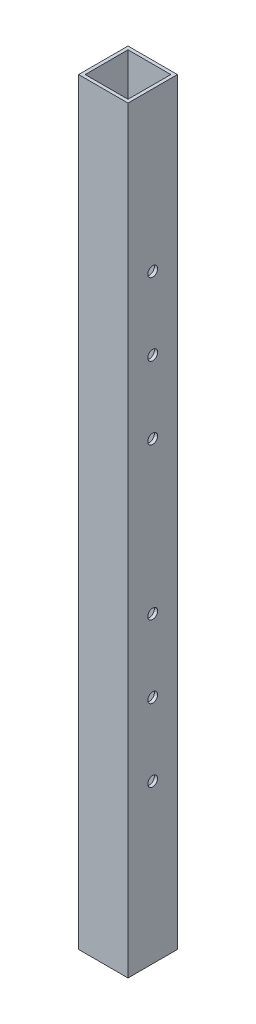
ISO-10303-21;
HEADER;
FILE_DESCRIPTION(('STEP AP214'),'2;1');
FILE_NAME('part.step','',(''),(''),'','','');
FILE_SCHEMA(('AUTOMOTIVE_DESIGN { 1 0 10303 214 1 1 1 1 }'));
ENDSEC;
DATA;
#1=APPLICATION_CONTEXT('core data for automotive mechanical design processes');
#2=APPLICATION_PROTOCOL_DEFINITION('international standard','automotive_design',2000,#1);
#3=PRODUCT_CONTEXT('',#1,'mechanical');
#4=PRODUCT('Part','Part','',(#3));
#5=PRODUCT_RELATED_PRODUCT_CATEGORY('part','',(#4));
#6=PRODUCT_DEFINITION_FORMATION('','',#4);
#7=PRODUCT_DEFINITION_CONTEXT('part definition',#1,'design');
#8=PRODUCT_DEFINITION('design','',#6,#7);
#9=PRODUCT_DEFINITION_SHAPE('','',#8);
#10=(LENGTH_UNIT() NAMED_UNIT(*) SI_UNIT(.MILLI.,.METRE.));
#11=(NAMED_UNIT(*) PLANE_ANGLE_UNIT() SI_UNIT($,.RADIAN.));
#12=(NAMED_UNIT(*) SI_UNIT($,.STERADIAN.) SOLID_ANGLE_UNIT());
#13=UNCERTAINTY_MEASURE_WITH_UNIT(LENGTH_MEASURE(1.E-05),#10,'distance_accuracy_value','');
#14=(GEOMETRIC_REPRESENTATION_CONTEXT(3) GLOBAL_UNCERTAINTY_ASSIGNED_CONTEXT((#13)) GLOBAL_UNIT_ASSIGNED_CONTEXT((#10,
#11,#12)) REPRESENTATION_CONTEXT('',''));
#15=CARTESIAN_POINT('',(0.,0.,0.));
#16=DIRECTION('',(0.,0.,1.));
#17=DIRECTION('',(1.,0.,0.));
#18=AXIS2_PLACEMENT_3D('',#15,#16,#17);
#19=CARTESIAN_POINT('',(0.,230.,0.));
#20=DIRECTION('',(0.,-1.,0.));
#21=DIRECTION('',(0.,0.,-1.));
#22=AXIS2_PLACEMENT_3D('',#19,#20,#21);
#23=PLANE('',#22);
#24=DIRECTION('',(0.,0.,-1.));
#25=VECTOR('',#24,1.);
#26=CARTESIAN_POINT('',(7.5,230.,7.5));
#27=LINE('',#26,#25);
#28=CARTESIAN_POINT('',(7.5,230.,7.5));
#29=VERTEX_POINT('',#28);
#30=CARTESIAN_POINT('',(7.5,230.,-7.5));
#31=VERTEX_POINT('',#30);
#32=EDGE_CURVE('E140',#29,#31,#27,.T.);
#33=ORIENTED_EDGE('',*,*,#32,.T.);
#34=DIRECTION('',(-1.,0.,0.));
#35=VECTOR('',#34,1.);
#36=CARTESIAN_POINT('',(-7.5,230.,-7.5));
#37=LINE('',#36,#35);
#38=CARTESIAN_POINT('',(-7.5,230.,-7.5));
#39=VERTEX_POINT('',#38);
#40=EDGE_CURVE('E143',#31,#39,#37,.T.);
#41=ORIENTED_EDGE('',*,*,#40,.T.);
#42=DIRECTION('',(0.,0.,1.));
#43=VECTOR('',#42,1.);
#44=CARTESIAN_POINT('',(-7.5,230.,7.5));
#45=LINE('',#44,#43);
#46=CARTESIAN_POINT('',(-7.5,230.,7.5));
#47=VERTEX_POINT('',#46);
#48=EDGE_CURVE('E146',#39,#47,#45,.T.);
#49=ORIENTED_EDGE('',*,*,#48,.T.);
#50=DIRECTION('',(1.,0.,0.));
#51=VECTOR('',#50,1.);
#52=CARTESIAN_POINT('',(-7.5,230.,7.5));
#53=LINE('',#52,#51);
#54=EDGE_CURVE('E148',#47,#29,#53,.T.);
#55=ORIENTED_EDGE('',*,*,#54,.T.);
#56=EDGE_LOOP('',(#33,#41,#49,#55));
#57=FACE_BOUND('',#56,.T.);
#58=DIRECTION('',(0.,0.,1.));
#59=VECTOR('',#58,1.);
#60=CARTESIAN_POINT('',(-6.5,230.,6.5));
#61=LINE('',#60,#59);
#62=CARTESIAN_POINT('',(-6.5,230.,-6.5));
#63=VERTEX_POINT('',#62);
#64=CARTESIAN_POINT('',(-6.5,230.,6.5));
#65=VERTEX_POINT('',#64);
#66=EDGE_CURVE('E102',#63,#65,#61,.T.);
#67=ORIENTED_EDGE('',*,*,#66,.F.);
#68=DIRECTION('',(-1.,0.,0.));
#69=VECTOR('',#68,1.);
#70=CARTESIAN_POINT('',(-6.5,230.,-6.5));
#71=LINE('',#70,#69);
#72=CARTESIAN_POINT('',(6.5,230.,-6.5));
#73=VERTEX_POINT('',#72);
#74=EDGE_CURVE('E124',#73,#63,#71,.T.);
#75=ORIENTED_EDGE('',*,*,#74,.F.);
#76=DIRECTION('',(0.,0.,-1.));
#77=VECTOR('',#76,1.);
#78=CARTESIAN_POINT('',(6.5,230.,6.5));
#79=LINE('',#78,#77);
#80=CARTESIAN_POINT('',(6.5,230.,6.5));
#81=VERTEX_POINT('',#80);
#82=EDGE_CURVE('E122',#81,#73,#79,.T.);
#83=ORIENTED_EDGE('',*,*,#82,.F.);
#84=DIRECTION('',(1.,0.,0.));
#85=VECTOR('',#84,1.);
#86=CARTESIAN_POINT('',(-6.5,230.,6.5));
#87=LINE('',#86,#85);
#88=EDGE_CURVE('E110',#65,#81,#87,.T.);
#89=ORIENTED_EDGE('',*,*,#88,.F.);
#90=EDGE_LOOP('',(#67,#75,#83,#89));
#91=FACE_BOUND('',#90,.T.);
#92=ADVANCED_FACE('F35',(#57,#91),#23,.F.);
#93=CARTESIAN_POINT('',(0.,0.,0.));
#94=DIRECTION('',(0.,-1.,0.));
#95=DIRECTION('',(0.,0.,-1.));
#96=AXIS2_PLACEMENT_3D('',#93,#94,#95);
#97=PLANE('',#96);
#98=DIRECTION('',(0.,0.,-1.));
#99=VECTOR('',#98,1.);
#100=CARTESIAN_POINT('',(7.5,0.,7.5));
#101=LINE('',#100,#99);
#102=CARTESIAN_POINT('',(7.5,0.,7.5));
#103=VERTEX_POINT('',#102);
#104=CARTESIAN_POINT('',(7.5,0.,-7.5));
#105=VERTEX_POINT('',#104);
#106=EDGE_CURVE('E118',#103,#105,#101,.T.);
#107=ORIENTED_EDGE('',*,*,#106,.F.);
#108=DIRECTION('',(1.,0.,0.));
#109=VECTOR('',#108,1.);
#110=CARTESIAN_POINT('',(-7.5,0.,7.5));
#111=LINE('',#110,#109);
#112=CARTESIAN_POINT('',(-7.5,0.,7.5));
#113=VERTEX_POINT('',#112);
#114=EDGE_CURVE('E144',#113,#103,#111,.T.);
#115=ORIENTED_EDGE('',*,*,#114,.F.);
#116=DIRECTION('',(0.,0.,1.));
#117=VECTOR('',#116,1.);
#118=CARTESIAN_POINT('',(-7.5,0.,7.5));
#119=LINE('',#118,#117);
#120=CARTESIAN_POINT('',(-7.5,0.,-7.5));
#121=VERTEX_POINT('',#120);
#122=EDGE_CURVE('E155',#121,#113,#119,.T.);
#123=ORIENTED_EDGE('',*,*,#122,.F.);
#124=DIRECTION('',(-1.,0.,0.));
#125=VECTOR('',#124,1.);
#126=CARTESIAN_POINT('',(-7.5,0.,-7.5));
#127=LINE('',#126,#125);
#128=EDGE_CURVE('E153',#105,#121,#127,.T.);
#129=ORIENTED_EDGE('',*,*,#128,.F.);
#130=EDGE_LOOP('',(#107,#115,#123,#129));
#131=FACE_BOUND('',#130,.T.);
#132=DIRECTION('',(-1.,0.,0.));
#133=VECTOR('',#132,1.);
#134=CARTESIAN_POINT('',(-6.5,0.,-6.5));
#135=LINE('',#134,#133);
#136=CARTESIAN_POINT('',(6.5,0.,-6.5));
#137=VERTEX_POINT('',#136);
#138=CARTESIAN_POINT('',(-6.5,0.,-6.5));
#139=VERTEX_POINT('',#138);
#140=EDGE_CURVE('E111',#137,#139,#135,.T.);
#141=ORIENTED_EDGE('',*,*,#140,.T.);
#142=DIRECTION('',(0.,0.,1.));
#143=VECTOR('',#142,1.);
#144=CARTESIAN_POINT('',(-6.5,0.,6.5));
#145=LINE('',#144,#143);
#146=CARTESIAN_POINT('',(-6.5,0.,6.5));
#147=VERTEX_POINT('',#146);
#148=EDGE_CURVE('E60',#139,#147,#145,.T.);
#149=ORIENTED_EDGE('',*,*,#148,.T.);
#150=DIRECTION('',(1.,0.,0.));
#151=VECTOR('',#150,1.);
#152=CARTESIAN_POINT('',(-6.5,0.,6.5));
#153=LINE('',#152,#151);
#154=CARTESIAN_POINT('',(6.5,0.,6.5));
#155=VERTEX_POINT('',#154);
#156=EDGE_CURVE('E117',#147,#155,#153,.T.);
#157=ORIENTED_EDGE('',*,*,#156,.T.);
#158=DIRECTION('',(0.,0.,-1.));
#159=VECTOR('',#158,1.);
#160=CARTESIAN_POINT('',(6.5,0.,6.5));
#161=LINE('',#160,#159);
#162=EDGE_CURVE('E132',#155,#137,#161,.T.);
#163=ORIENTED_EDGE('',*,*,#162,.T.);
#164=EDGE_LOOP('',(#141,#149,#157,#163));
#165=FACE_BOUND('',#164,.T.);
#166=ADVANCED_FACE('F227',(#131,#165),#97,.T.);
#167=CARTESIAN_POINT('',(7.5,230.,7.5));
#168=DIRECTION('',(-1.,0.,0.));
#169=DIRECTION('',(0.,0.,1.));
#170=AXIS2_PLACEMENT_3D('',#167,#168,#169);
#171=PLANE('',#170);
#172=CARTESIAN_POINT('',(7.5,138.,0.));
#173=DIRECTION('',(1.,0.,0.));
#174=DIRECTION('',(0.,0.,-1.));
#175=AXIS2_PLACEMENT_3D('',#172,#173,#174);
#176=CIRCLE('',#175,1.5);
#177=CARTESIAN_POINT('',(7.5,138.,-1.49999999999998));
#178=VERTEX_POINT('',#177);
#179=EDGE_CURVE('E310',#178,#178,#176,.T.);
#180=ORIENTED_EDGE('',*,*,#179,.F.);
#181=EDGE_LOOP('',(#180));
#182=FACE_BOUND('',#181,.T.);
#183=CARTESIAN_POINT('',(7.5,182.,0.));
#184=DIRECTION('',(1.,0.,0.));
#185=DIRECTION('',(0.,0.,-1.));
#186=AXIS2_PLACEMENT_3D('',#183,#184,#185);
#187=CIRCLE('',#186,1.5);
#188=CARTESIAN_POINT('',(7.5,182.,-1.49999999999998));
#189=VERTEX_POINT('',#188);
#190=EDGE_CURVE('E318',#189,#189,#187,.T.);
#191=ORIENTED_EDGE('',*,*,#190,.F.);
#192=EDGE_LOOP('',(#191));
#193=FACE_BOUND('',#192,.T.);
#194=CARTESIAN_POINT('',(7.5,48.,0.));
#195=DIRECTION('',(1.,0.,0.));
#196=DIRECTION('',(0.,0.,1.));
#197=AXIS2_PLACEMENT_3D('',#194,#195,#196);
#198=CIRCLE('',#197,1.5);
#199=CARTESIAN_POINT('',(7.5,48.,1.50000000000002));
#200=VERTEX_POINT('',#199);
#201=EDGE_CURVE('E324',#200,#200,#198,.T.);
#202=ORIENTED_EDGE('',*,*,#201,.F.);
#203=EDGE_LOOP('',(#202));
#204=FACE_BOUND('',#203,.T.);
#205=CARTESIAN_POINT('',(7.5,92.,0.));
#206=DIRECTION('',(1.,0.,0.));
#207=DIRECTION('',(0.,0.,1.));
#208=AXIS2_PLACEMENT_3D('',#205,#206,#207);
#209=CIRCLE('',#208,1.5);
#210=CARTESIAN_POINT('',(7.5,92.,1.50000000000002));
#211=VERTEX_POINT('',#210);
#212=EDGE_CURVE('E330',#211,#211,#209,.T.);
#213=ORIENTED_EDGE('',*,*,#212,.F.);
#214=EDGE_LOOP('',(#213));
#215=FACE_BOUND('',#214,.T.);
#216=CARTESIAN_POINT('',(7.5,70.,0.));
#217=DIRECTION('',(1.,0.,0.));
#218=DIRECTION('',(0.,0.,1.));
#219=AXIS2_PLACEMENT_3D('',#216,#217,#218);
#220=CIRCLE('',#219,1.5);
#221=CARTESIAN_POINT('',(7.5,70.,1.50000000000002));
#222=VERTEX_POINT('',#221);
#223=EDGE_CURVE('E336',#222,#222,#220,.T.);
#224=ORIENTED_EDGE('',*,*,#223,.F.);
#225=EDGE_LOOP('',(#224));
#226=FACE_BOUND('',#225,.T.);
#227=CARTESIAN_POINT('',(7.5,160.,0.));
#228=DIRECTION('',(1.,0.,0.));
#229=DIRECTION('',(0.,0.,-1.));
#230=AXIS2_PLACEMENT_3D('',#227,#228,#229);
#231=CIRCLE('',#230,1.5);
#232=CARTESIAN_POINT('',(7.5,160.,-1.49999999999998));
#233=VERTEX_POINT('',#232);
#234=EDGE_CURVE('E198',#233,#233,#231,.T.);
#235=ORIENTED_EDGE('',*,*,#234,.F.);
#236=EDGE_LOOP('',(#235));
#237=FACE_BOUND('',#236,.T.);
#238=ORIENTED_EDGE('',*,*,#106,.T.);
#239=DIRECTION('',(0.,-1.,0.));
#240=VECTOR('',#239,1.);
#241=CARTESIAN_POINT('',(7.5,230.,-7.5));
#242=LINE('',#241,#240);
#243=EDGE_CURVE('E11',#31,#105,#242,.T.);
#244=ORIENTED_EDGE('',*,*,#243,.F.);
#245=ORIENTED_EDGE('',*,*,#32,.F.);
#246=DIRECTION('',(0.,-1.,0.));
#247=VECTOR('',#246,1.);
#248=CARTESIAN_POINT('',(7.5,230.,7.5));
#249=LINE('',#248,#247);
#250=EDGE_CURVE('E150',#29,#103,#249,.T.);
#251=ORIENTED_EDGE('',*,*,#250,.T.);
#252=EDGE_LOOP('',(#238,#244,#245,#251));
#253=FACE_BOUND('',#252,.T.);
#254=ADVANCED_FACE('F37',(#182,#193,#204,#215,#226,#237,#253),#171,.F.);
#255=CARTESIAN_POINT('',(-7.5,230.,-7.5));
#256=DIRECTION('',(0.,0.,1.));
#257=DIRECTION('',(1.,0.,0.));
#258=AXIS2_PLACEMENT_3D('',#255,#256,#257);
#259=PLANE('',#258);
#260=ORIENTED_EDGE('',*,*,#128,.T.);
#261=DIRECTION('',(0.,-1.,0.));
#262=VECTOR('',#261,1.);
#263=CARTESIAN_POINT('',(-7.5,230.,-7.5));
#264=LINE('',#263,#262);
#265=EDGE_CURVE('E44',#39,#121,#264,.T.);
#266=ORIENTED_EDGE('',*,*,#265,.F.);
#267=ORIENTED_EDGE('',*,*,#40,.F.);
#268=ORIENTED_EDGE('',*,*,#243,.T.);
#269=EDGE_LOOP('',(#260,#266,#267,#268));
#270=FACE_BOUND('',#269,.T.);
#271=ADVANCED_FACE('F235',(#270),#259,.F.);
#272=CARTESIAN_POINT('',(-7.5,230.,7.5));
#273=DIRECTION('',(1.,0.,0.));
#274=DIRECTION('',(0.,0.,-1.));
#275=AXIS2_PLACEMENT_3D('',#272,#273,#274);
#276=PLANE('',#275);
#277=CARTESIAN_POINT('',(-7.5,138.,0.));
#278=DIRECTION('',(1.,0.,0.));
#279=DIRECTION('',(0.,0.,-1.));
#280=AXIS2_PLACEMENT_3D('',#277,#278,#279);
#281=CIRCLE('',#280,1.5);
#282=CARTESIAN_POINT('',(-7.5,138.,-1.49999999999998));
#283=VERTEX_POINT('',#282);
#284=EDGE_CURVE('E173',#283,#283,#281,.T.);
#285=ORIENTED_EDGE('',*,*,#284,.T.);
#286=EDGE_LOOP('',(#285));
#287=FACE_BOUND('',#286,.T.);
#288=CARTESIAN_POINT('',(-7.5,182.,0.));
#289=DIRECTION('',(1.,0.,0.));
#290=DIRECTION('',(0.,0.,-1.));
#291=AXIS2_PLACEMENT_3D('',#288,#289,#290);
#292=CIRCLE('',#291,1.5);
#293=CARTESIAN_POINT('',(-7.5,182.,-1.49999999999998));
#294=VERTEX_POINT('',#293);
#295=EDGE_CURVE('E313',#294,#294,#292,.T.);
#296=ORIENTED_EDGE('',*,*,#295,.T.);
#297=EDGE_LOOP('',(#296));
#298=FACE_BOUND('',#297,.T.);
#299=CARTESIAN_POINT('',(-7.5,48.,0.));
#300=DIRECTION('',(1.,0.,0.));
#301=DIRECTION('',(0.,0.,1.));
#302=AXIS2_PLACEMENT_3D('',#299,#300,#301);
#303=CIRCLE('',#302,1.5);
#304=CARTESIAN_POINT('',(-7.5,48.,1.50000000000002));
#305=VERTEX_POINT('',#304);
#306=EDGE_CURVE('E321',#305,#305,#303,.T.);
#307=ORIENTED_EDGE('',*,*,#306,.T.);
#308=EDGE_LOOP('',(#307));
#309=FACE_BOUND('',#308,.T.);
#310=CARTESIAN_POINT('',(-7.5,92.,0.));
#311=DIRECTION('',(1.,0.,0.));
#312=DIRECTION('',(0.,0.,1.));
#313=AXIS2_PLACEMENT_3D('',#310,#311,#312);
#314=CIRCLE('',#313,1.5);
#315=CARTESIAN_POINT('',(-7.5,92.,1.50000000000002));
#316=VERTEX_POINT('',#315);
#317=EDGE_CURVE('E327',#316,#316,#314,.T.);
#318=ORIENTED_EDGE('',*,*,#317,.T.);
#319=EDGE_LOOP('',(#318));
#320=FACE_BOUND('',#319,.T.);
#321=CARTESIAN_POINT('',(-7.5,70.,0.));
#322=DIRECTION('',(1.,0.,0.));
#323=DIRECTION('',(0.,0.,1.));
#324=AXIS2_PLACEMENT_3D('',#321,#322,#323);
#325=CIRCLE('',#324,1.5);
#326=CARTESIAN_POINT('',(-7.5,70.,1.50000000000002));
#327=VERTEX_POINT('',#326);
#328=EDGE_CURVE('E333',#327,#327,#325,.T.);
#329=ORIENTED_EDGE('',*,*,#328,.T.);
#330=EDGE_LOOP('',(#329));
#331=FACE_BOUND('',#330,.T.);
#332=CARTESIAN_POINT('',(-7.5,160.,0.));
#333=DIRECTION('',(1.,0.,0.));
#334=DIRECTION('',(0.,0.,-1.));
#335=AXIS2_PLACEMENT_3D('',#332,#333,#334);
#336=CIRCLE('',#335,1.5);
#337=CARTESIAN_POINT('',(-7.5,160.,-1.49999999999998));
#338=VERTEX_POINT('',#337);
#339=EDGE_CURVE('E168',#338,#338,#336,.T.);
#340=ORIENTED_EDGE('',*,*,#339,.T.);
#341=EDGE_LOOP('',(#340));
#342=FACE_BOUND('',#341,.T.);
#343=ORIENTED_EDGE('',*,*,#122,.T.);
#344=DIRECTION('',(0.,-1.,0.));
#345=VECTOR('',#344,1.);
#346=CARTESIAN_POINT('',(-7.5,230.,7.5));
#347=LINE('',#346,#345);
#348=EDGE_CURVE('E160',#47,#113,#347,.T.);
#349=ORIENTED_EDGE('',*,*,#348,.F.);
#350=ORIENTED_EDGE('',*,*,#48,.F.);
#351=ORIENTED_EDGE('',*,*,#265,.T.);
#352=EDGE_LOOP('',(#343,#349,#350,#351));
#353=FACE_BOUND('',#352,.T.);
#354=ADVANCED_FACE('F220',(#287,#298,#309,#320,#331,#342,#353),#276,.F.);
#355=CARTESIAN_POINT('',(-7.5,230.,7.5));
#356=DIRECTION('',(0.,0.,-1.));
#357=DIRECTION('',(-1.,0.,0.));
#358=AXIS2_PLACEMENT_3D('',#355,#356,#357);
#359=PLANE('',#358);
#360=ORIENTED_EDGE('',*,*,#114,.T.);
#361=ORIENTED_EDGE('',*,*,#250,.F.);
#362=ORIENTED_EDGE('',*,*,#54,.F.);
#363=ORIENTED_EDGE('',*,*,#348,.T.);
#364=EDGE_LOOP('',(#360,#361,#362,#363));
#365=FACE_BOUND('',#364,.T.);
#366=ADVANCED_FACE('F209',(#365),#359,.F.);
#367=CARTESIAN_POINT('',(-6.5,230.,6.5));
#368=DIRECTION('',(1.,0.,0.));
#369=DIRECTION('',(0.,0.,-1.));
#370=AXIS2_PLACEMENT_3D('',#367,#368,#369);
#371=PLANE('',#370);
#372=CARTESIAN_POINT('',(-6.5,138.,0.));
#373=DIRECTION('',(1.,0.,0.));
#374=DIRECTION('',(0.,0.,-1.));
#375=AXIS2_PLACEMENT_3D('',#372,#373,#374);
#376=CIRCLE('',#375,1.5);
#377=CARTESIAN_POINT('',(-6.5,138.,-1.49999999999998));
#378=VERTEX_POINT('',#377);
#379=EDGE_CURVE('E195',#378,#378,#376,.T.);
#380=ORIENTED_EDGE('',*,*,#379,.F.);
#381=EDGE_LOOP('',(#380));
#382=FACE_BOUND('',#381,.T.);
#383=CARTESIAN_POINT('',(-6.5,182.,0.));
#384=DIRECTION('',(1.,0.,0.));
#385=DIRECTION('',(0.,0.,-1.));
#386=AXIS2_PLACEMENT_3D('',#383,#384,#385);
#387=CIRCLE('',#386,1.5);
#388=CARTESIAN_POINT('',(-6.5,182.,-1.49999999999998));
#389=VERTEX_POINT('',#388);
#390=EDGE_CURVE('E183',#389,#389,#387,.T.);
#391=ORIENTED_EDGE('',*,*,#390,.F.);
#392=EDGE_LOOP('',(#391));
#393=FACE_BOUND('',#392,.T.);
#394=CARTESIAN_POINT('',(-6.5,48.,0.));
#395=DIRECTION('',(1.,0.,0.));
#396=DIRECTION('',(0.,0.,-1.));
#397=AXIS2_PLACEMENT_3D('',#394,#395,#396);
#398=CIRCLE('',#397,1.5);
#399=CARTESIAN_POINT('',(-6.5,48.,-1.49999999999998));
#400=VERTEX_POINT('',#399);
#401=EDGE_CURVE('E180',#400,#400,#398,.T.);
#402=ORIENTED_EDGE('',*,*,#401,.F.);
#403=EDGE_LOOP('',(#402));
#404=FACE_BOUND('',#403,.T.);
#405=CARTESIAN_POINT('',(-6.5,92.,0.));
#406=DIRECTION('',(1.,0.,0.));
#407=DIRECTION('',(0.,0.,-1.));
#408=AXIS2_PLACEMENT_3D('',#405,#406,#407);
#409=CIRCLE('',#408,1.5);
#410=CARTESIAN_POINT('',(-6.5,92.,-1.49999999999998));
#411=VERTEX_POINT('',#410);
#412=EDGE_CURVE('E177',#411,#411,#409,.T.);
#413=ORIENTED_EDGE('',*,*,#412,.F.);
#414=EDGE_LOOP('',(#413));
#415=FACE_BOUND('',#414,.T.);
#416=CARTESIAN_POINT('',(-6.5,70.,0.));
#417=DIRECTION('',(1.,0.,0.));
#418=DIRECTION('',(0.,0.,-1.));
#419=AXIS2_PLACEMENT_3D('',#416,#417,#418);
#420=CIRCLE('',#419,1.5);
#421=CARTESIAN_POINT('',(-6.5,70.,-1.49999999999998));
#422=VERTEX_POINT('',#421);
#423=EDGE_CURVE('E172',#422,#422,#420,.T.);
#424=ORIENTED_EDGE('',*,*,#423,.F.);
#425=EDGE_LOOP('',(#424));
#426=FACE_BOUND('',#425,.T.);
#427=CARTESIAN_POINT('',(-6.5,160.,0.));
#428=DIRECTION('',(1.,0.,0.));
#429=DIRECTION('',(0.,0.,-1.));
#430=AXIS2_PLACEMENT_3D('',#427,#428,#429);
#431=CIRCLE('',#430,1.5);
#432=CARTESIAN_POINT('',(-6.5,160.,-1.49999999999998));
#433=VERTEX_POINT('',#432);
#434=EDGE_CURVE('E130',#433,#433,#431,.T.);
#435=ORIENTED_EDGE('',*,*,#434,.F.);
#436=EDGE_LOOP('',(#435));
#437=FACE_BOUND('',#436,.T.);
#438=ORIENTED_EDGE('',*,*,#148,.F.);
#439=DIRECTION('',(0.,-1.,0.));
#440=VECTOR('',#439,1.);
#441=CARTESIAN_POINT('',(-6.5,230.,-6.5));
#442=LINE('',#441,#440);
#443=EDGE_CURVE('E106',#63,#139,#442,.T.);
#444=ORIENTED_EDGE('',*,*,#443,.F.);
#445=ORIENTED_EDGE('',*,*,#66,.T.);
#446=DIRECTION('',(0.,-1.,0.));
#447=VECTOR('',#446,1.);
#448=CARTESIAN_POINT('',(-6.5,230.,6.5));
#449=LINE('',#448,#447);
#450=EDGE_CURVE('E105',#65,#147,#449,.T.);
#451=ORIENTED_EDGE('',*,*,#450,.T.);
#452=EDGE_LOOP('',(#438,#444,#445,#451));
#453=FACE_BOUND('',#452,.T.);
#454=ADVANCED_FACE('F104',(#382,#393,#404,#415,#426,#437,#453),#371,.T.);
#455=CARTESIAN_POINT('',(-6.5,230.,6.5));
#456=DIRECTION('',(0.,0.,-1.));
#457=DIRECTION('',(-1.,0.,0.));
#458=AXIS2_PLACEMENT_3D('',#455,#456,#457);
#459=PLANE('',#458);
#460=ORIENTED_EDGE('',*,*,#156,.F.);
#461=ORIENTED_EDGE('',*,*,#450,.F.);
#462=ORIENTED_EDGE('',*,*,#88,.T.);
#463=DIRECTION('',(0.,-1.,0.));
#464=VECTOR('',#463,1.);
#465=CARTESIAN_POINT('',(6.5,230.,6.5));
#466=LINE('',#465,#464);
#467=EDGE_CURVE('E119',#81,#155,#466,.T.);
#468=ORIENTED_EDGE('',*,*,#467,.T.);
#469=EDGE_LOOP('',(#460,#461,#462,#468));
#470=FACE_BOUND('',#469,.T.);
#471=ADVANCED_FACE('F114',(#470),#459,.T.);
#472=CARTESIAN_POINT('',(6.5,230.,6.5));
#473=DIRECTION('',(-1.,0.,0.));
#474=DIRECTION('',(0.,0.,1.));
#475=AXIS2_PLACEMENT_3D('',#472,#473,#474);
#476=PLANE('',#475);
#477=CARTESIAN_POINT('',(6.5,138.,0.));
#478=DIRECTION('',(-1.,0.,0.));
#479=DIRECTION('',(0.,0.,1.));
#480=AXIS2_PLACEMENT_3D('',#477,#478,#479);
#481=CIRCLE('',#480,1.5);
#482=CARTESIAN_POINT('',(6.5,138.,1.50000000000002));
#483=VERTEX_POINT('',#482);
#484=EDGE_CURVE('E39',#483,#483,#481,.T.);
#485=ORIENTED_EDGE('',*,*,#484,.F.);
#486=EDGE_LOOP('',(#485));
#487=FACE_BOUND('',#486,.T.);
#488=CARTESIAN_POINT('',(6.5,182.,0.));
#489=DIRECTION('',(-1.,0.,0.));
#490=DIRECTION('',(0.,0.,1.));
#491=AXIS2_PLACEMENT_3D('',#488,#489,#490);
#492=CIRCLE('',#491,1.5);
#493=CARTESIAN_POINT('',(6.5,182.,1.50000000000002));
#494=VERTEX_POINT('',#493);
#495=EDGE_CURVE('E181',#494,#494,#492,.T.);
#496=ORIENTED_EDGE('',*,*,#495,.F.);
#497=EDGE_LOOP('',(#496));
#498=FACE_BOUND('',#497,.T.);
#499=CARTESIAN_POINT('',(6.5,48.,0.));
#500=DIRECTION('',(-1.,0.,0.));
#501=DIRECTION('',(0.,0.,1.));
#502=AXIS2_PLACEMENT_3D('',#499,#500,#501);
#503=CIRCLE('',#502,1.5);
#504=CARTESIAN_POINT('',(6.5,48.,1.50000000000002));
#505=VERTEX_POINT('',#504);
#506=EDGE_CURVE('E178',#505,#505,#503,.T.);
#507=ORIENTED_EDGE('',*,*,#506,.F.);
#508=EDGE_LOOP('',(#507));
#509=FACE_BOUND('',#508,.T.);
#510=CARTESIAN_POINT('',(6.5,92.,0.));
#511=DIRECTION('',(-1.,0.,0.));
#512=DIRECTION('',(0.,0.,1.));
#513=AXIS2_PLACEMENT_3D('',#510,#511,#512);
#514=CIRCLE('',#513,1.5);
#515=CARTESIAN_POINT('',(6.5,92.,1.50000000000002));
#516=VERTEX_POINT('',#515);
#517=EDGE_CURVE('E174',#516,#516,#514,.T.);
#518=ORIENTED_EDGE('',*,*,#517,.F.);
#519=EDGE_LOOP('',(#518));
#520=FACE_BOUND('',#519,.T.);
#521=CARTESIAN_POINT('',(6.5,70.,0.));
#522=DIRECTION('',(-1.,0.,0.));
#523=DIRECTION('',(0.,0.,1.));
#524=AXIS2_PLACEMENT_3D('',#521,#522,#523);
#525=CIRCLE('',#524,1.5);
#526=CARTESIAN_POINT('',(6.5,70.,1.50000000000002));
#527=VERTEX_POINT('',#526);
#528=EDGE_CURVE('E169',#527,#527,#525,.T.);
#529=ORIENTED_EDGE('',*,*,#528,.F.);
#530=EDGE_LOOP('',(#529));
#531=FACE_BOUND('',#530,.T.);
#532=CARTESIAN_POINT('',(6.5,160.,0.));
#533=DIRECTION('',(-1.,0.,0.));
#534=DIRECTION('',(0.,0.,1.));
#535=AXIS2_PLACEMENT_3D('',#532,#533,#534);
#536=CIRCLE('',#535,1.5);
#537=CARTESIAN_POINT('',(6.5,160.,1.50000000000002));
#538=VERTEX_POINT('',#537);
#539=EDGE_CURVE('E165',#538,#538,#536,.T.);
#540=ORIENTED_EDGE('',*,*,#539,.F.);
#541=EDGE_LOOP('',(#540));
#542=FACE_BOUND('',#541,.T.);
#543=ORIENTED_EDGE('',*,*,#162,.F.);
#544=ORIENTED_EDGE('',*,*,#467,.F.);
#545=ORIENTED_EDGE('',*,*,#82,.T.);
#546=DIRECTION('',(0.,-1.,0.));
#547=VECTOR('',#546,1.);
#548=CARTESIAN_POINT('',(6.5,230.,-6.5));
#549=LINE('',#548,#547);
#550=EDGE_CURVE('E52',#73,#137,#549,.T.);
#551=ORIENTED_EDGE('',*,*,#550,.T.);
#552=EDGE_LOOP('',(#543,#544,#545,#551));
#553=FACE_BOUND('',#552,.T.);
#554=ADVANCED_FACE('F217',(#487,#498,#509,#520,#531,#542,#553),#476,.T.);
#555=CARTESIAN_POINT('',(-6.5,230.,-6.5));
#556=DIRECTION('',(0.,0.,1.));
#557=DIRECTION('',(1.,0.,0.));
#558=AXIS2_PLACEMENT_3D('',#555,#556,#557);
#559=PLANE('',#558);
#560=ORIENTED_EDGE('',*,*,#140,.F.);
#561=ORIENTED_EDGE('',*,*,#550,.F.);
#562=ORIENTED_EDGE('',*,*,#74,.T.);
#563=ORIENTED_EDGE('',*,*,#443,.T.);
#564=EDGE_LOOP('',(#560,#561,#562,#563));
#565=FACE_BOUND('',#564,.T.);
#566=ADVANCED_FACE('F259',(#565),#559,.T.);
#567=CARTESIAN_POINT('',(-7.5,160.,0.));
#568=DIRECTION('',(1.,0.,0.));
#569=DIRECTION('',(0.,0.,-1.));
#570=AXIS2_PLACEMENT_3D('',#567,#568,#569);
#571=CYLINDRICAL_SURFACE('',#570,1.5);
#572=ORIENTED_EDGE('',*,*,#539,.T.);
#573=EDGE_LOOP('',(#572));
#574=FACE_BOUND('',#573,.T.);
#575=ORIENTED_EDGE('',*,*,#234,.T.);
#576=EDGE_LOOP('',(#575));
#577=FACE_BOUND('',#576,.T.);
#578=ADVANCED_FACE('F261',(#574,#577),#571,.F.);
#579=ORIENTED_EDGE('',*,*,#434,.T.);
#580=EDGE_LOOP('',(#579));
#581=FACE_BOUND('',#580,.T.);
#582=ORIENTED_EDGE('',*,*,#339,.F.);
#583=EDGE_LOOP('',(#582));
#584=FACE_BOUND('',#583,.T.);
#585=ADVANCED_FACE('F205',(#581,#584),#571,.F.);
#586=CARTESIAN_POINT('',(-7.5,70.,0.));
#587=DIRECTION('',(1.,0.,0.));
#588=DIRECTION('',(0.,0.,-1.));
#589=AXIS2_PLACEMENT_3D('',#586,#587,#588);
#590=CYLINDRICAL_SURFACE('',#589,1.5);
#591=ORIENTED_EDGE('',*,*,#528,.T.);
#592=EDGE_LOOP('',(#591));
#593=FACE_BOUND('',#592,.T.);
#594=ORIENTED_EDGE('',*,*,#223,.T.);
#595=EDGE_LOOP('',(#594));
#596=FACE_BOUND('',#595,.T.);
#597=ADVANCED_FACE('F272',(#593,#596),#590,.F.);
#598=CARTESIAN_POINT('',(-7.5,92.,0.));
#599=DIRECTION('',(1.,0.,0.));
#600=DIRECTION('',(0.,0.,-1.));
#601=AXIS2_PLACEMENT_3D('',#598,#599,#600);
#602=CYLINDRICAL_SURFACE('',#601,1.5);
#603=ORIENTED_EDGE('',*,*,#517,.T.);
#604=EDGE_LOOP('',(#603));
#605=FACE_BOUND('',#604,.T.);
#606=ORIENTED_EDGE('',*,*,#212,.T.);
#607=EDGE_LOOP('',(#606));
#608=FACE_BOUND('',#607,.T.);
#609=ADVANCED_FACE('F275',(#605,#608),#602,.F.);
#610=CARTESIAN_POINT('',(-7.5,48.,0.));
#611=DIRECTION('',(1.,0.,0.));
#612=DIRECTION('',(0.,0.,-1.));
#613=AXIS2_PLACEMENT_3D('',#610,#611,#612);
#614=CYLINDRICAL_SURFACE('',#613,1.5);
#615=ORIENTED_EDGE('',*,*,#506,.T.);
#616=EDGE_LOOP('',(#615));
#617=FACE_BOUND('',#616,.T.);
#618=ORIENTED_EDGE('',*,*,#201,.T.);
#619=EDGE_LOOP('',(#618));
#620=FACE_BOUND('',#619,.T.);
#621=ADVANCED_FACE('F280',(#617,#620),#614,.F.);
#622=CARTESIAN_POINT('',(-7.5,182.,0.));
#623=DIRECTION('',(1.,0.,0.));
#624=DIRECTION('',(0.,0.,-1.));
#625=AXIS2_PLACEMENT_3D('',#622,#623,#624);
#626=CYLINDRICAL_SURFACE('',#625,1.5);
#627=ORIENTED_EDGE('',*,*,#495,.T.);
#628=EDGE_LOOP('',(#627));
#629=FACE_BOUND('',#628,.T.);
#630=ORIENTED_EDGE('',*,*,#190,.T.);
#631=EDGE_LOOP('',(#630));
#632=FACE_BOUND('',#631,.T.);
#633=ADVANCED_FACE('F285',(#629,#632),#626,.F.);
#634=CARTESIAN_POINT('',(-7.5,138.,0.));
#635=DIRECTION('',(1.,0.,0.));
#636=DIRECTION('',(0.,0.,-1.));
#637=AXIS2_PLACEMENT_3D('',#634,#635,#636);
#638=CYLINDRICAL_SURFACE('',#637,1.5);
#639=ORIENTED_EDGE('',*,*,#484,.T.);
#640=EDGE_LOOP('',(#639));
#641=FACE_BOUND('',#640,.T.);
#642=ORIENTED_EDGE('',*,*,#179,.T.);
#643=EDGE_LOOP('',(#642));
#644=FACE_BOUND('',#643,.T.);
#645=ADVANCED_FACE('F290',(#641,#644),#638,.F.);
#646=ORIENTED_EDGE('',*,*,#423,.T.);
#647=EDGE_LOOP('',(#646));
#648=FACE_BOUND('',#647,.T.);
#649=ORIENTED_EDGE('',*,*,#328,.F.);
#650=EDGE_LOOP('',(#649));
#651=FACE_BOUND('',#650,.T.);
#652=ADVANCED_FACE('F277',(#648,#651),#590,.F.);
#653=ORIENTED_EDGE('',*,*,#412,.T.);
#654=EDGE_LOOP('',(#653));
#655=FACE_BOUND('',#654,.T.);
#656=ORIENTED_EDGE('',*,*,#317,.F.);
#657=EDGE_LOOP('',(#656));
#658=FACE_BOUND('',#657,.T.);
#659=ADVANCED_FACE('F282',(#655,#658),#602,.F.);
#660=ORIENTED_EDGE('',*,*,#401,.T.);
#661=EDGE_LOOP('',(#660));
#662=FACE_BOUND('',#661,.T.);
#663=ORIENTED_EDGE('',*,*,#306,.F.);
#664=EDGE_LOOP('',(#663));
#665=FACE_BOUND('',#664,.T.);
#666=ADVANCED_FACE('F287',(#662,#665),#614,.F.);
#667=ORIENTED_EDGE('',*,*,#390,.T.);
#668=EDGE_LOOP('',(#667));
#669=FACE_BOUND('',#668,.T.);
#670=ORIENTED_EDGE('',*,*,#295,.F.);
#671=EDGE_LOOP('',(#670));
#672=FACE_BOUND('',#671,.T.);
#673=ADVANCED_FACE('F291',(#669,#672),#626,.F.);
#674=ORIENTED_EDGE('',*,*,#379,.T.);
#675=EDGE_LOOP('',(#674));
#676=FACE_BOUND('',#675,.T.);
#677=ORIENTED_EDGE('',*,*,#284,.F.);
#678=EDGE_LOOP('',(#677));
#679=FACE_BOUND('',#678,.T.);
#680=ADVANCED_FACE('F294',(#676,#679),#638,.F.);
#681=CLOSED_SHELL('',(#92,#166,#254,#271,#354,#366,#454,#471,#554,#566,#578,#585,#597,#609,#621,
#633,#645,#652,#659,#666,#673,#680));
#682=MANIFOLD_SOLID_BREP('B2',#681);
#683=ADVANCED_BREP_SHAPE_REPRESENTATION('',(#18,#682),#14);
#684=SHAPE_DEFINITION_REPRESENTATION(#9,#683);
ENDSEC;
END-ISO-10303-21;
